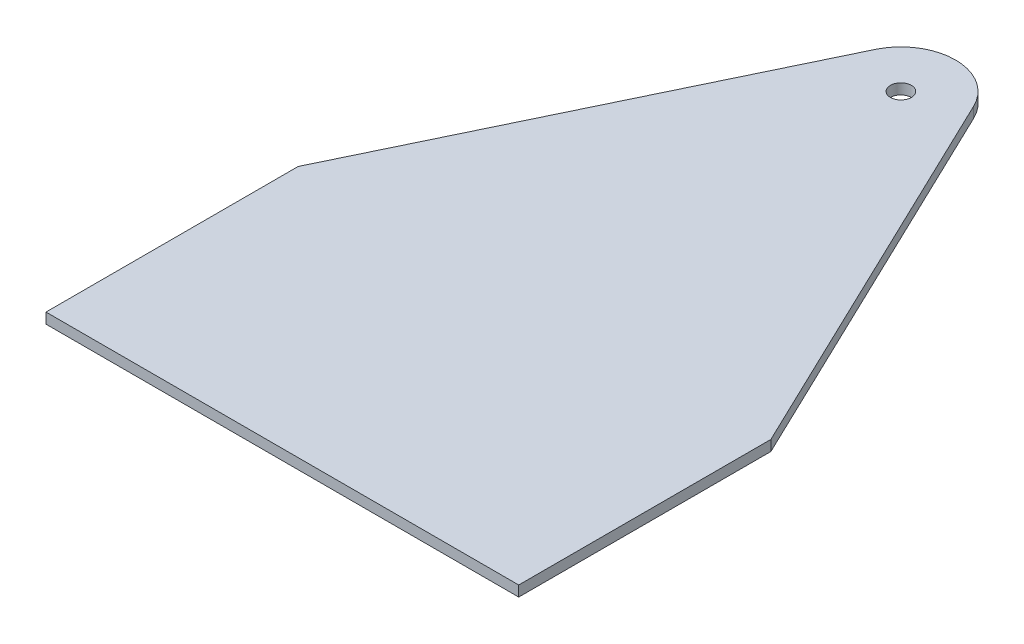
ISO-10303-21;
HEADER;
FILE_DESCRIPTION(('STEP AP214'),'2;1');
FILE_NAME('part.step','',(''),(''),'','','');
FILE_SCHEMA(('AUTOMOTIVE_DESIGN { 1 0 10303 214 1 1 1 1 }'));
ENDSEC;
DATA;
#1=APPLICATION_CONTEXT('core data for automotive mechanical design processes');
#2=APPLICATION_PROTOCOL_DEFINITION('international standard','automotive_design',2000,#1);
#3=PRODUCT_CONTEXT('',#1,'mechanical');
#4=PRODUCT('Part','Part','',(#3));
#5=PRODUCT_RELATED_PRODUCT_CATEGORY('part','',(#4));
#6=PRODUCT_DEFINITION_FORMATION('','',#4);
#7=PRODUCT_DEFINITION_CONTEXT('part definition',#1,'design');
#8=PRODUCT_DEFINITION('design','',#6,#7);
#9=PRODUCT_DEFINITION_SHAPE('','',#8);
#10=(LENGTH_UNIT() NAMED_UNIT(*) SI_UNIT(.MILLI.,.METRE.));
#11=(NAMED_UNIT(*) PLANE_ANGLE_UNIT() SI_UNIT($,.RADIAN.));
#12=(NAMED_UNIT(*) SI_UNIT($,.STERADIAN.) SOLID_ANGLE_UNIT());
#13=UNCERTAINTY_MEASURE_WITH_UNIT(LENGTH_MEASURE(1.E-05),#10,'distance_accuracy_value','');
#14=(GEOMETRIC_REPRESENTATION_CONTEXT(3) GLOBAL_UNCERTAINTY_ASSIGNED_CONTEXT((#13)) GLOBAL_UNIT_ASSIGNED_CONTEXT((#10,
#11,#12)) REPRESENTATION_CONTEXT('',''));
#15=CARTESIAN_POINT('',(0.,0.,0.));
#16=DIRECTION('',(0.,0.,1.));
#17=DIRECTION('',(1.,0.,0.));
#18=AXIS2_PLACEMENT_3D('',#15,#16,#17);
#19=CARTESIAN_POINT('',(0.,3.175,-186.944528262714));
#20=DIRECTION('',(0.,-1.,0.));
#21=DIRECTION('',(0.,0.,-1.));
#22=AXIS2_PLACEMENT_3D('',#19,#20,#21);
#23=PLANE('',#22);
#24=DIRECTION('',(0.,0.,-1.));
#25=VECTOR('',#24,1.);
#26=CARTESIAN_POINT('',(71.4375,3.175,0.));
#27=LINE('',#26,#25);
#28=CARTESIAN_POINT('',(71.4375,3.175,0.));
#29=VERTEX_POINT('',#28);
#30=CARTESIAN_POINT('',(71.4375,3.175,-76.2));
#31=VERTEX_POINT('',#30);
#32=EDGE_CURVE('E129',#29,#31,#27,.T.);
#33=ORIENTED_EDGE('',*,*,#32,.T.);
#34=DIRECTION('',(-0.432692307692308,0.,-0.901541661191487));
#35=VECTOR('',#34,1.);
#36=CARTESIAN_POINT('',(14.8624344049308,3.175,-194.0777105852));
#37=LINE('',#36,#35);
#38=CARTESIAN_POINT('',(14.8624344049308,3.175,-194.0777105852));
#39=VERTEX_POINT('',#38);
#40=EDGE_CURVE('E87',#31,#39,#37,.T.);
#41=ORIENTED_EDGE('',*,*,#40,.T.);
#42=CARTESIAN_POINT('',(0.,3.175,-186.944528262714));
#43=DIRECTION('',(0.,1.,0.));
#44=DIRECTION('',(0.,0.,-1.));
#45=AXIS2_PLACEMENT_3D('',#42,#43,#44);
#46=CIRCLE('',#45,16.4855769230769);
#47=CARTESIAN_POINT('',(-14.8624344049309,3.175,-194.0777105852));
#48=VERTEX_POINT('',#47);
#49=EDGE_CURVE('E100',#39,#48,#46,.T.);
#50=ORIENTED_EDGE('',*,*,#49,.T.);
#51=DIRECTION('',(-0.432692307692307,0.,0.901541661191487));
#52=VECTOR('',#51,1.);
#53=CARTESIAN_POINT('',(-71.4375,3.175,-76.2));
#54=LINE('',#53,#52);
#55=CARTESIAN_POINT('',(-71.4375,3.175,-76.2));
#56=VERTEX_POINT('',#55);
#57=EDGE_CURVE('E94',#48,#56,#54,.T.);
#58=ORIENTED_EDGE('',*,*,#57,.T.);
#59=DIRECTION('',(0.,0.,1.));
#60=VECTOR('',#59,1.);
#61=CARTESIAN_POINT('',(-71.4375,3.175,0.));
#62=LINE('',#61,#60);
#63=CARTESIAN_POINT('',(-71.4375,3.175,0.));
#64=VERTEX_POINT('',#63);
#65=EDGE_CURVE('E98',#56,#64,#62,.T.);
#66=ORIENTED_EDGE('',*,*,#65,.T.);
#67=DIRECTION('',(1.,0.,0.));
#68=VECTOR('',#67,1.);
#69=CARTESIAN_POINT('',(-71.4375,3.175,0.));
#70=LINE('',#69,#68);
#71=EDGE_CURVE('E50',#64,#29,#70,.T.);
#72=ORIENTED_EDGE('',*,*,#71,.T.);
#73=EDGE_LOOP('',(#33,#41,#50,#58,#66,#72));
#74=FACE_BOUND('',#73,.T.);
#75=CARTESIAN_POINT('',(0.,3.175,-186.944528262714));
#76=DIRECTION('',(0.,1.,0.));
#77=DIRECTION('',(0.,0.,1.));
#78=AXIS2_PLACEMENT_3D('',#75,#76,#77);
#79=CIRCLE('',#78,3.17499999999999);
#80=CARTESIAN_POINT('',(0.,3.175,-183.769528262714));
#81=VERTEX_POINT('',#80);
#82=EDGE_CURVE('E122',#81,#81,#79,.T.);
#83=ORIENTED_EDGE('',*,*,#82,.F.);
#84=EDGE_LOOP('',(#83));
#85=FACE_BOUND('',#84,.T.);
#86=ADVANCED_FACE('F33',(#74,#85),#23,.F.);
#87=CARTESIAN_POINT('',(0.,0.,-186.944528262714));
#88=DIRECTION('',(0.,-1.,0.));
#89=DIRECTION('',(0.,0.,-1.));
#90=AXIS2_PLACEMENT_3D('',#87,#88,#89);
#91=PLANE('',#90);
#92=DIRECTION('',(0.,0.,-1.));
#93=VECTOR('',#92,1.);
#94=CARTESIAN_POINT('',(71.4375,0.,0.));
#95=LINE('',#94,#93);
#96=CARTESIAN_POINT('',(71.4375,0.,0.));
#97=VERTEX_POINT('',#96);
#98=CARTESIAN_POINT('',(71.4375,0.,-76.2));
#99=VERTEX_POINT('',#98);
#100=EDGE_CURVE('E118',#97,#99,#95,.T.);
#101=ORIENTED_EDGE('',*,*,#100,.F.);
#102=DIRECTION('',(1.,0.,0.));
#103=VECTOR('',#102,1.);
#104=CARTESIAN_POINT('',(-71.4375,0.,0.));
#105=LINE('',#104,#103);
#106=CARTESIAN_POINT('',(-71.4375,0.,0.));
#107=VERTEX_POINT('',#106);
#108=EDGE_CURVE('E79',#107,#97,#105,.T.);
#109=ORIENTED_EDGE('',*,*,#108,.F.);
#110=DIRECTION('',(0.,0.,1.));
#111=VECTOR('',#110,1.);
#112=CARTESIAN_POINT('',(-71.4375,0.,0.));
#113=LINE('',#112,#111);
#114=CARTESIAN_POINT('',(-71.4375,0.,-76.2));
#115=VERTEX_POINT('',#114);
#116=EDGE_CURVE('E73',#115,#107,#113,.T.);
#117=ORIENTED_EDGE('',*,*,#116,.F.);
#118=DIRECTION('',(-0.432692307692307,0.,0.901541661191487));
#119=VECTOR('',#118,1.);
#120=CARTESIAN_POINT('',(-71.4375,0.,-76.2));
#121=LINE('',#120,#119);
#122=CARTESIAN_POINT('',(-14.8624344049309,0.,-194.0777105852));
#123=VERTEX_POINT('',#122);
#124=EDGE_CURVE('E108',#123,#115,#121,.T.);
#125=ORIENTED_EDGE('',*,*,#124,.F.);
#126=CARTESIAN_POINT('',(0.,0.,-186.944528262714));
#127=DIRECTION('',(0.,1.,0.));
#128=DIRECTION('',(0.,0.,-1.));
#129=AXIS2_PLACEMENT_3D('',#126,#127,#128);
#130=CIRCLE('',#129,16.4855769230769);
#131=CARTESIAN_POINT('',(14.8624344049308,0.,-194.0777105852));
#132=VERTEX_POINT('',#131);
#133=EDGE_CURVE('E124',#132,#123,#130,.T.);
#134=ORIENTED_EDGE('',*,*,#133,.F.);
#135=DIRECTION('',(-0.432692307692308,0.,-0.901541661191487));
#136=VECTOR('',#135,1.);
#137=CARTESIAN_POINT('',(14.8624344049308,0.,-194.0777105852));
#138=LINE('',#137,#136);
#139=EDGE_CURVE('E121',#99,#132,#138,.T.);
#140=ORIENTED_EDGE('',*,*,#139,.F.);
#141=EDGE_LOOP('',(#101,#109,#117,#125,#134,#140));
#142=FACE_BOUND('',#141,.T.);
#143=CARTESIAN_POINT('',(0.,0.,-186.944528262714));
#144=DIRECTION('',(0.,1.,0.));
#145=DIRECTION('',(0.,0.,1.));
#146=AXIS2_PLACEMENT_3D('',#143,#144,#145);
#147=CIRCLE('',#146,3.17499999999999);
#148=CARTESIAN_POINT('',(0.,0.,-183.769528262714));
#149=VERTEX_POINT('',#148);
#150=EDGE_CURVE('E222',#149,#149,#147,.T.);
#151=ORIENTED_EDGE('',*,*,#150,.T.);
#152=EDGE_LOOP('',(#151));
#153=FACE_BOUND('',#152,.T.);
#154=ADVANCED_FACE('F138',(#142,#153),#91,.T.);
#155=CARTESIAN_POINT('',(71.4375,3.175,0.));
#156=DIRECTION('',(-1.,0.,0.));
#157=DIRECTION('',(0.,0.,1.));
#158=AXIS2_PLACEMENT_3D('',#155,#156,#157);
#159=PLANE('',#158);
#160=ORIENTED_EDGE('',*,*,#100,.T.);
#161=DIRECTION('',(0.,-1.,0.));
#162=VECTOR('',#161,1.);
#163=CARTESIAN_POINT('',(71.4375,3.175,-76.2));
#164=LINE('',#163,#162);
#165=EDGE_CURVE('E11',#31,#99,#164,.T.);
#166=ORIENTED_EDGE('',*,*,#165,.F.);
#167=ORIENTED_EDGE('',*,*,#32,.F.);
#168=DIRECTION('',(0.,-1.,0.));
#169=VECTOR('',#168,1.);
#170=CARTESIAN_POINT('',(71.4375,3.175,0.));
#171=LINE('',#170,#169);
#172=EDGE_CURVE('E114',#29,#97,#171,.T.);
#173=ORIENTED_EDGE('',*,*,#172,.T.);
#174=EDGE_LOOP('',(#160,#166,#167,#173));
#175=FACE_BOUND('',#174,.T.);
#176=ADVANCED_FACE('F35',(#175),#159,.F.);
#177=CARTESIAN_POINT('',(14.8624344049308,3.175,-194.0777105852));
#178=DIRECTION('',(-0.901541661191486,0.,0.432692307692308));
#179=DIRECTION('',(0.432692307692308,0.,0.901541661191487));
#180=AXIS2_PLACEMENT_3D('',#177,#178,#179);
#181=PLANE('',#180);
#182=ORIENTED_EDGE('',*,*,#139,.T.);
#183=DIRECTION('',(0.,-1.,0.));
#184=VECTOR('',#183,1.);
#185=CARTESIAN_POINT('',(14.8624344049308,3.175,-194.0777105852));
#186=LINE('',#185,#184);
#187=EDGE_CURVE('E42',#39,#132,#186,.T.);
#188=ORIENTED_EDGE('',*,*,#187,.F.);
#189=ORIENTED_EDGE('',*,*,#40,.F.);
#190=ORIENTED_EDGE('',*,*,#165,.T.);
#191=EDGE_LOOP('',(#182,#188,#189,#190));
#192=FACE_BOUND('',#191,.T.);
#193=ADVANCED_FACE('F163',(#192),#181,.F.);
#194=CARTESIAN_POINT('',(0.,3.175,-186.944528262714));
#195=DIRECTION('',(0.,-1.,0.));
#196=DIRECTION('',(0.,0.,-1.));
#197=AXIS2_PLACEMENT_3D('',#194,#195,#196);
#198=CYLINDRICAL_SURFACE('',#197,16.4855769230769);
#199=ORIENTED_EDGE('',*,*,#133,.T.);
#200=DIRECTION('',(0.,-1.,0.));
#201=VECTOR('',#200,1.);
#202=CARTESIAN_POINT('',(-14.8624344049309,3.175,-194.0777105852));
#203=LINE('',#202,#201);
#204=EDGE_CURVE('E109',#48,#123,#203,.T.);
#205=ORIENTED_EDGE('',*,*,#204,.F.);
#206=ORIENTED_EDGE('',*,*,#49,.F.);
#207=ORIENTED_EDGE('',*,*,#187,.T.);
#208=EDGE_LOOP('',(#199,#205,#206,#207));
#209=FACE_BOUND('',#208,.T.);
#210=ADVANCED_FACE('F135',(#209),#198,.T.);
#211=CARTESIAN_POINT('',(-71.4375,3.175,-76.2));
#212=DIRECTION('',(0.901541661191487,0.,0.432692307692307));
#213=DIRECTION('',(0.432692307692307,0.,-0.901541661191487));
#214=AXIS2_PLACEMENT_3D('',#211,#212,#213);
#215=PLANE('',#214);
#216=ORIENTED_EDGE('',*,*,#124,.T.);
#217=DIRECTION('',(0.,-1.,0.));
#218=VECTOR('',#217,1.);
#219=CARTESIAN_POINT('',(-71.4375,3.175,-76.2));
#220=LINE('',#219,#218);
#221=EDGE_CURVE('E105',#56,#115,#220,.T.);
#222=ORIENTED_EDGE('',*,*,#221,.F.);
#223=ORIENTED_EDGE('',*,*,#57,.F.);
#224=ORIENTED_EDGE('',*,*,#204,.T.);
#225=EDGE_LOOP('',(#216,#222,#223,#224));
#226=FACE_BOUND('',#225,.T.);
#227=ADVANCED_FACE('F106',(#226),#215,.F.);
#228=CARTESIAN_POINT('',(-71.4375,3.175,0.));
#229=DIRECTION('',(1.,0.,0.));
#230=DIRECTION('',(0.,0.,-1.));
#231=AXIS2_PLACEMENT_3D('',#228,#229,#230);
#232=PLANE('',#231);
#233=ORIENTED_EDGE('',*,*,#116,.T.);
#234=DIRECTION('',(0.,-1.,0.));
#235=VECTOR('',#234,1.);
#236=CARTESIAN_POINT('',(-71.4375,3.175,0.));
#237=LINE('',#236,#235);
#238=EDGE_CURVE('E110',#64,#107,#237,.T.);
#239=ORIENTED_EDGE('',*,*,#238,.F.);
#240=ORIENTED_EDGE('',*,*,#65,.F.);
#241=ORIENTED_EDGE('',*,*,#221,.T.);
#242=EDGE_LOOP('',(#233,#239,#240,#241));
#243=FACE_BOUND('',#242,.T.);
#244=ADVANCED_FACE('F112',(#243),#232,.F.);
#245=CARTESIAN_POINT('',(-71.4375,3.175,0.));
#246=DIRECTION('',(0.,0.,-1.));
#247=DIRECTION('',(-1.,0.,0.));
#248=AXIS2_PLACEMENT_3D('',#245,#246,#247);
#249=PLANE('',#248);
#250=ORIENTED_EDGE('',*,*,#108,.T.);
#251=ORIENTED_EDGE('',*,*,#172,.F.);
#252=ORIENTED_EDGE('',*,*,#71,.F.);
#253=ORIENTED_EDGE('',*,*,#238,.T.);
#254=EDGE_LOOP('',(#250,#251,#252,#253));
#255=FACE_BOUND('',#254,.T.);
#256=ADVANCED_FACE('F143',(#255),#249,.F.);
#257=CARTESIAN_POINT('',(0.,3.175,-186.944528262714));
#258=DIRECTION('',(0.,-1.,0.));
#259=DIRECTION('',(0.,0.,-1.));
#260=AXIS2_PLACEMENT_3D('',#257,#258,#259);
#261=CYLINDRICAL_SURFACE('',#260,3.17499999999999);
#262=ORIENTED_EDGE('',*,*,#82,.T.);
#263=EDGE_LOOP('',(#262));
#264=FACE_BOUND('',#263,.T.);
#265=ORIENTED_EDGE('',*,*,#150,.F.);
#266=EDGE_LOOP('',(#265));
#267=FACE_BOUND('',#266,.T.);
#268=ADVANCED_FACE('F145',(#264,#267),#261,.F.);
#269=CLOSED_SHELL('',(#86,#154,#176,#193,#210,#227,#244,#256,#268));
#270=MANIFOLD_SOLID_BREP('B2',#269);
#271=ADVANCED_BREP_SHAPE_REPRESENTATION('',(#18,#270),#14);
#272=SHAPE_DEFINITION_REPRESENTATION(#9,#271);
ENDSEC;
END-ISO-10303-21;
